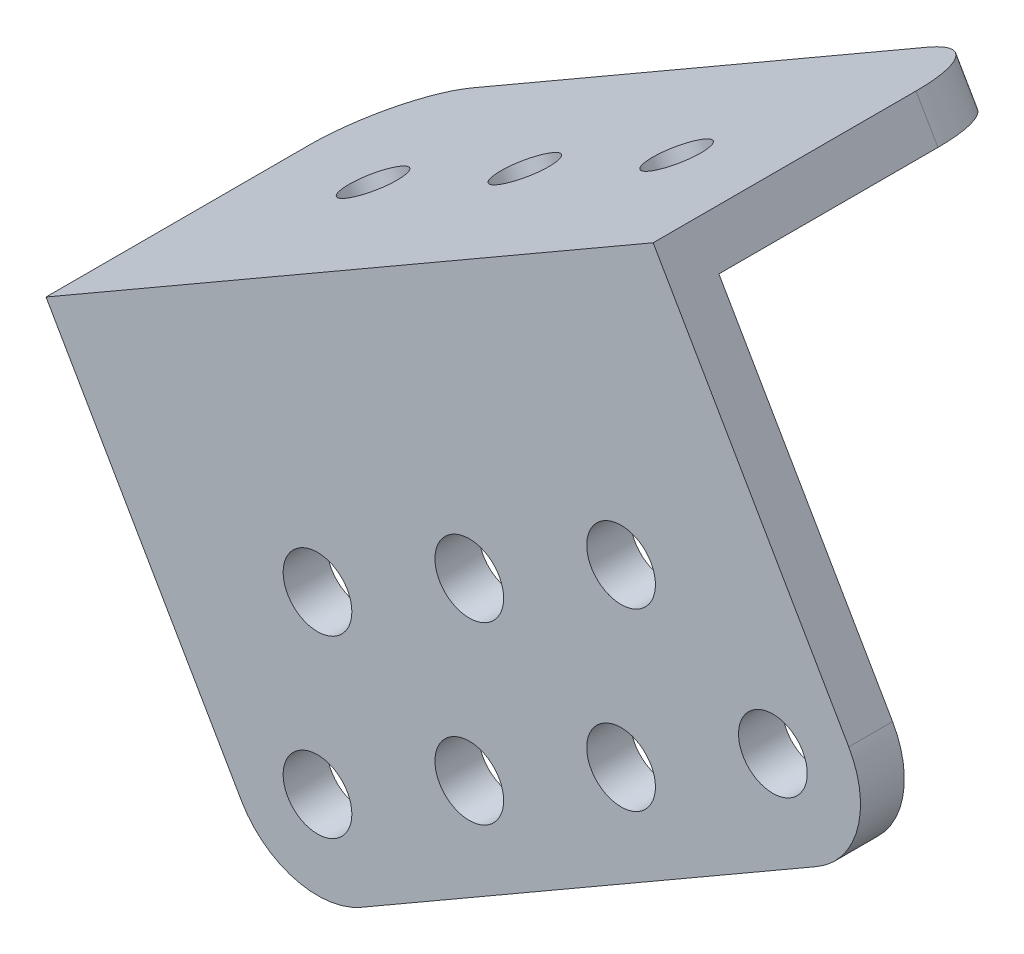
ISO-10303-21;
HEADER;
FILE_DESCRIPTION(('STEP AP214'),'2;1');
FILE_NAME('part.step','',(''),(''),'','','');
FILE_SCHEMA(('AUTOMOTIVE_DESIGN { 1 0 10303 214 1 1 1 1 }'));
ENDSEC;
DATA;
#1=APPLICATION_CONTEXT('core data for automotive mechanical design processes');
#2=APPLICATION_PROTOCOL_DEFINITION('international standard','automotive_design',2000,#1);
#3=PRODUCT_CONTEXT('',#1,'mechanical');
#4=PRODUCT('Part','Part','',(#3));
#5=PRODUCT_RELATED_PRODUCT_CATEGORY('part','',(#4));
#6=PRODUCT_DEFINITION_FORMATION('','',#4);
#7=PRODUCT_DEFINITION_CONTEXT('part definition',#1,'design');
#8=PRODUCT_DEFINITION('design','',#6,#7);
#9=PRODUCT_DEFINITION_SHAPE('','',#8);
#10=(LENGTH_UNIT() NAMED_UNIT(*) SI_UNIT(.MILLI.,.METRE.));
#11=(NAMED_UNIT(*) PLANE_ANGLE_UNIT() SI_UNIT($,.RADIAN.));
#12=(NAMED_UNIT(*) SI_UNIT($,.STERADIAN.) SOLID_ANGLE_UNIT());
#13=UNCERTAINTY_MEASURE_WITH_UNIT(LENGTH_MEASURE(1.E-05),#10,'distance_accuracy_value','');
#14=(GEOMETRIC_REPRESENTATION_CONTEXT(3) GLOBAL_UNCERTAINTY_ASSIGNED_CONTEXT((#13)) GLOBAL_UNIT_ASSIGNED_CONTEXT((#10,
#11,#12)) REPRESENTATION_CONTEXT('',''));
#15=CARTESIAN_POINT('',(0.,0.,0.));
#16=DIRECTION('',(0.,0.,1.));
#17=DIRECTION('',(1.,0.,0.));
#18=AXIS2_PLACEMENT_3D('',#15,#16,#17);
#19=CARTESIAN_POINT('',(0.,0.,25.4));
#20=DIRECTION('',(0.,0.,1.));
#21=DIRECTION('',(1.,0.,0.));
#22=AXIS2_PLACEMENT_3D('',#19,#20,#21);
#23=PLANE('',#22);
#24=CARTESIAN_POINT('',(116.913296347439,132.964619955457,25.4));
#25=DIRECTION('',(0.,0.,1.));
#26=DIRECTION('',(1.,0.,0.));
#27=AXIS2_PLACEMENT_3D('',#24,#25,#26);
#28=CIRCLE('',#27,2.48920000000001);
#29=CARTESIAN_POINT('',(119.402496347439,132.964619955457,25.4));
#30=VERTEX_POINT('',#29);
#31=EDGE_CURVE('E186',#30,#30,#28,.T.);
#32=ORIENTED_EDGE('',*,*,#31,.F.);
#33=EDGE_LOOP('',(#32));
#34=FACE_BOUND('',#33,.T.);
#35=CARTESIAN_POINT('',(138.910341603564,132.964619955457,25.4));
#36=DIRECTION('',(0.,0.,1.));
#37=DIRECTION('',(1.,0.,0.));
#38=AXIS2_PLACEMENT_3D('',#35,#36,#37);
#39=CIRCLE('',#38,2.48920000000001);
#40=CARTESIAN_POINT('',(141.399541603564,132.964619955457,25.4));
#41=VERTEX_POINT('',#40);
#42=EDGE_CURVE('E194',#41,#41,#39,.T.);
#43=ORIENTED_EDGE('',*,*,#42,.F.);
#44=EDGE_LOOP('',(#43));
#45=FACE_BOUND('',#44,.T.);
#46=CARTESIAN_POINT('',(116.913296347439,120.264619955457,25.4));
#47=DIRECTION('',(0.,0.,1.));
#48=DIRECTION('',(1.,0.,0.));
#49=AXIS2_PLACEMENT_3D('',#46,#47,#48);
#50=CIRCLE('',#49,2.4892);
#51=CARTESIAN_POINT('',(119.402496347439,120.264619955457,25.4));
#52=VERTEX_POINT('',#51);
#53=EDGE_CURVE('E202',#52,#52,#50,.T.);
#54=ORIENTED_EDGE('',*,*,#53,.F.);
#55=EDGE_LOOP('',(#54));
#56=FACE_BOUND('',#55,.T.);
#57=DIRECTION('',(0.866025403784439,0.5,0.));
#58=VECTOR('',#57,1.);
#59=CARTESIAN_POINT('',(103.590512405345,105.240358641426,25.4));
#60=LINE('',#59,#58);
#61=CARTESIAN_POINT('',(109.089773719377,108.415358641426,25.4));
#62=VERTEX_POINT('',#61);
#63=CARTESIAN_POINT('',(142.085341603564,127.465358641426,25.4));
#64=VERTEX_POINT('',#63);
#65=EDGE_CURVE('E211',#62,#64,#60,.T.);
#66=ORIENTED_EDGE('',*,*,#65,.T.);
#67=CARTESIAN_POINT('',(138.910341603564,132.964619955457,25.4));
#68=DIRECTION('',(0.,0.,1.));
#69=DIRECTION('',(1.,0.,0.));
#70=AXIS2_PLACEMENT_3D('',#67,#68,#69);
#71=CIRCLE('',#70,6.35);
#72=CARTESIAN_POINT('',(144.409602917595,136.139619955457,25.4));
#73=VERTEX_POINT('',#72);
#74=EDGE_CURVE('E271',#64,#73,#71,.T.);
#75=ORIENTED_EDGE('',*,*,#74,.T.);
#76=DIRECTION('',(-0.5,0.866025403784439,0.));
#77=VECTOR('',#76,1.);
#78=CARTESIAN_POINT('',(147.584602917595,130.640358641426,25.4));
#79=LINE('',#78,#77);
#80=CARTESIAN_POINT('',(130.236080289533,160.688881269488,25.4));
#81=VERTEX_POINT('',#80);
#82=EDGE_CURVE('E215',#73,#81,#79,.T.);
#83=ORIENTED_EDGE('',*,*,#82,.T.);
#84=DIRECTION('',(-0.866025403784439,-0.5,0.));
#85=VECTOR('',#84,1.);
#86=CARTESIAN_POINT('',(86.2419897772831,135.288881269488,25.4));
#87=LINE('',#86,#85);
#88=CARTESIAN_POINT('',(86.2419897772831,135.288881269488,25.4));
#89=VERTEX_POINT('',#88);
#90=EDGE_CURVE('E218',#81,#89,#87,.T.);
#91=ORIENTED_EDGE('',*,*,#90,.T.);
#92=DIRECTION('',(0.5,-0.866025403784438,0.));
#93=VECTOR('',#92,1.);
#94=CARTESIAN_POINT('',(86.2419897772831,135.288881269488,25.4));
#95=LINE('',#94,#93);
#96=CARTESIAN_POINT('',(100.415512405345,110.739619955457,25.4));
#97=VERTEX_POINT('',#96);
#98=EDGE_CURVE('E221',#89,#97,#95,.T.);
#99=ORIENTED_EDGE('',*,*,#98,.T.);
#100=CARTESIAN_POINT('',(105.914773719377,113.914619955457,25.4));
#101=DIRECTION('',(0.,0.,1.));
#102=DIRECTION('',(1.,0.,0.));
#103=AXIS2_PLACEMENT_3D('',#100,#101,#102);
#104=CIRCLE('',#103,6.35);
#105=EDGE_CURVE('E268',#97,#62,#104,.T.);
#106=ORIENTED_EDGE('',*,*,#105,.T.);
#107=EDGE_LOOP('',(#66,#75,#83,#91,#99,#106));
#108=FACE_BOUND('',#107,.T.);
#109=CARTESIAN_POINT('',(105.914773719377,113.914619955457,25.4));
#110=DIRECTION('',(0.,0.,1.));
#111=DIRECTION('',(1.,0.,0.));
#112=AXIS2_PLACEMENT_3D('',#109,#110,#111);
#113=CIRCLE('',#112,2.4892);
#114=CARTESIAN_POINT('',(108.403973719377,113.914619955457,25.4));
#115=VERTEX_POINT('',#114);
#116=EDGE_CURVE('E206',#115,#115,#113,.T.);
#117=ORIENTED_EDGE('',*,*,#116,.F.);
#118=EDGE_LOOP('',(#117));
#119=FACE_BOUND('',#118,.T.);
#120=CARTESIAN_POINT('',(127.911818975501,126.614619955457,25.4));
#121=DIRECTION('',(0.,0.,1.));
#122=DIRECTION('',(1.,0.,0.));
#123=AXIS2_PLACEMENT_3D('',#120,#121,#122);
#124=CIRCLE('',#123,2.48919999999997);
#125=CARTESIAN_POINT('',(130.401018975501,126.614619955457,25.4));
#126=VERTEX_POINT('',#125);
#127=EDGE_CURVE('E198',#126,#126,#124,.T.);
#128=ORIENTED_EDGE('',*,*,#127,.F.);
#129=EDGE_LOOP('',(#128));
#130=FACE_BOUND('',#129,.T.);
#131=CARTESIAN_POINT('',(127.911818975501,139.314619955457,25.4));
#132=DIRECTION('',(0.,0.,1.));
#133=DIRECTION('',(1.,0.,0.));
#134=AXIS2_PLACEMENT_3D('',#131,#132,#133);
#135=CIRCLE('',#134,2.48919999999997);
#136=CARTESIAN_POINT('',(130.401018975501,139.314619955457,25.4));
#137=VERTEX_POINT('',#136);
#138=EDGE_CURVE('E190',#137,#137,#135,.T.);
#139=ORIENTED_EDGE('',*,*,#138,.F.);
#140=EDGE_LOOP('',(#139));
#141=FACE_BOUND('',#140,.T.);
#142=CARTESIAN_POINT('',(105.914773719377,126.614619955457,25.4));
#143=DIRECTION('',(0.,0.,1.));
#144=DIRECTION('',(1.,0.,0.));
#145=AXIS2_PLACEMENT_3D('',#142,#143,#144);
#146=CIRCLE('',#145,2.48919999999998);
#147=CARTESIAN_POINT('',(108.403973719377,126.614619955457,25.4));
#148=VERTEX_POINT('',#147);
#149=EDGE_CURVE('E182',#148,#148,#146,.T.);
#150=ORIENTED_EDGE('',*,*,#149,.F.);
#151=EDGE_LOOP('',(#150));
#152=FACE_BOUND('',#151,.T.);
#153=ADVANCED_FACE('F37',(#34,#45,#56,#108,#119,#130,#141,#152),#23,.T.);
#154=CARTESIAN_POINT('',(0.,0.,0.));
#155=DIRECTION('',(0.,0.,1.));
#156=DIRECTION('',(1.,0.,0.));
#157=AXIS2_PLACEMENT_3D('',#154,#155,#156);
#158=PLANE('',#157);
#159=DIRECTION('',(-0.866025403784438,-0.500000000000001,0.));
#160=VECTOR('',#159,1.);
#161=CARTESIAN_POINT('',(144.834972260579,165.451381269489,0.));
#162=LINE('',#161,#160);
#163=CARTESIAN_POINT('',(126.324318975501,154.764250612473,0.));
#164=VERTEX_POINT('',#163);
#165=CARTESIAN_POINT('',(93.3287510913142,135.714250612473,0.));
#166=VERTEX_POINT('',#165);
#167=EDGE_CURVE('E135',#164,#166,#162,.T.);
#168=ORIENTED_EDGE('',*,*,#167,.T.);
#169=DIRECTION('',(0.5,-0.866025403784438,0.));
#170=VECTOR('',#169,1.);
#171=CARTESIAN_POINT('',(128.76255766147,74.3410973273947,0.));
#172=LINE('',#171,#170);
#173=CARTESIAN_POINT('',(91.7412510913142,138.463881269488,0.));
#174=VERTEX_POINT('',#173);
#175=EDGE_CURVE('E53',#166,#174,#172,.F.);
#176=ORIENTED_EDGE('',*,*,#175,.T.);
#177=DIRECTION('',(-0.866025403784439,-0.5,0.));
#178=VECTOR('',#177,1.);
#179=CARTESIAN_POINT('',(86.2419897772831,135.288881269488,0.));
#180=LINE('',#179,#178);
#181=CARTESIAN_POINT('',(124.736818975501,157.513881269488,0.));
#182=VERTEX_POINT('',#181);
#183=EDGE_CURVE('E210',#182,#174,#180,.T.);
#184=ORIENTED_EDGE('',*,*,#183,.F.);
#185=DIRECTION('',(-0.5,0.866025403784439,0.));
#186=VECTOR('',#185,1.);
#187=CARTESIAN_POINT('',(161.758125545657,93.3910973273946,0.));
#188=LINE('',#187,#186);
#189=EDGE_CURVE('E285',#182,#164,#188,.F.);
#190=ORIENTED_EDGE('',*,*,#189,.T.);
#191=EDGE_LOOP('',(#168,#176,#184,#190));
#192=FACE_BOUND('',#191,.T.);
#193=ADVANCED_FACE('F334',(#192),#158,.F.);
#194=CARTESIAN_POINT('',(103.590512405345,105.240358641426,25.4));
#195=DIRECTION('',(-0.5,0.866025403784439,0.));
#196=DIRECTION('',(-0.866025403784439,-0.5,0.));
#197=AXIS2_PLACEMENT_3D('',#194,#195,#196);
#198=PLANE('',#197);
#199=DIRECTION('',(-0.866025403784438,-0.500000000000001,0.));
#200=VECTOR('',#199,1.);
#201=CARTESIAN_POINT('',(160.595994888642,138.152489298442,22.225));
#202=LINE('',#201,#200);
#203=CARTESIAN_POINT('',(142.085341603564,127.465358641426,22.225));
#204=VERTEX_POINT('',#203);
#205=CARTESIAN_POINT('',(109.089773719377,108.415358641426,22.225));
#206=VERTEX_POINT('',#205);
#207=EDGE_CURVE('E136',#204,#206,#202,.T.);
#208=ORIENTED_EDGE('',*,*,#207,.F.);
#209=DIRECTION('',(0.,0.,-1.));
#210=VECTOR('',#209,1.);
#211=CARTESIAN_POINT('',(142.085341603564,127.465358641426,25.4));
#212=LINE('',#211,#210);
#213=EDGE_CURVE('E265',#204,#64,#212,.F.);
#214=ORIENTED_EDGE('',*,*,#213,.T.);
#215=ORIENTED_EDGE('',*,*,#65,.F.);
#216=DIRECTION('',(0.,0.,-1.));
#217=VECTOR('',#216,1.);
#218=CARTESIAN_POINT('',(109.089773719377,108.415358641426,25.4));
#219=LINE('',#218,#217);
#220=EDGE_CURVE('E261',#62,#206,#219,.T.);
#221=ORIENTED_EDGE('',*,*,#220,.T.);
#222=EDGE_LOOP('',(#208,#214,#215,#221));
#223=FACE_BOUND('',#222,.T.);
#224=ADVANCED_FACE('F356',(#223),#198,.F.);
#225=CARTESIAN_POINT('',(147.584602917595,130.640358641426,25.4));
#226=DIRECTION('',(-0.866025403784439,-0.5,0.));
#227=DIRECTION('',(0.5,-0.866025403784439,0.));
#228=AXIS2_PLACEMENT_3D('',#225,#226,#227);
#229=PLANE('',#228);
#230=ORIENTED_EDGE('',*,*,#82,.F.);
#231=DIRECTION('',(0.,0.,-1.));
#232=VECTOR('',#231,1.);
#233=CARTESIAN_POINT('',(144.409602917595,136.139619955457,25.4));
#234=LINE('',#233,#232);
#235=CARTESIAN_POINT('',(144.409602917595,136.139619955457,22.225));
#236=VERTEX_POINT('',#235);
#237=EDGE_CURVE('E252',#73,#236,#234,.T.);
#238=ORIENTED_EDGE('',*,*,#237,.T.);
#239=DIRECTION('',(-0.5,0.866025403784439,0.));
#240=VECTOR('',#239,1.);
#241=CARTESIAN_POINT('',(147.584602917595,130.640358641426,22.225));
#242=LINE('',#241,#240);
#243=CARTESIAN_POINT('',(131.823580289533,157.939250612473,22.225));
#244=VERTEX_POINT('',#243);
#245=EDGE_CURVE('E177',#236,#244,#242,.T.);
#246=ORIENTED_EDGE('',*,*,#245,.T.);
#247=DIRECTION('',(0.,0.,-1.));
#248=VECTOR('',#247,1.);
#249=CARTESIAN_POINT('',(131.823580289533,157.939250612473,25.4));
#250=LINE('',#249,#248);
#251=CARTESIAN_POINT('',(131.823580289533,157.939250612473,6.35));
#252=VERTEX_POINT('',#251);
#253=EDGE_CURVE('E133',#244,#252,#250,.T.);
#254=ORIENTED_EDGE('',*,*,#253,.T.);
#255=DIRECTION('',(-0.5,0.866025403784439,0.));
#256=VECTOR('',#255,1.);
#257=CARTESIAN_POINT('',(147.584602917595,130.640358641426,6.35));
#258=LINE('',#257,#256);
#259=CARTESIAN_POINT('',(130.236080289533,160.688881269488,6.35));
#260=VERTEX_POINT('',#259);
#261=EDGE_CURVE('E233',#252,#260,#258,.T.);
#262=ORIENTED_EDGE('',*,*,#261,.T.);
#263=DIRECTION('',(0.,0.,-1.));
#264=VECTOR('',#263,1.);
#265=CARTESIAN_POINT('',(130.236080289533,160.688881269488,25.4));
#266=LINE('',#265,#264);
#267=EDGE_CURVE('E230',#81,#260,#266,.T.);
#268=ORIENTED_EDGE('',*,*,#267,.F.);
#269=EDGE_LOOP('',(#230,#238,#246,#254,#262,#268));
#270=FACE_BOUND('',#269,.T.);
#271=ADVANCED_FACE('F341',(#270),#229,.F.);
#272=CARTESIAN_POINT('',(86.2419897772831,135.288881269488,25.4));
#273=DIRECTION('',(0.5,-0.866025403784439,0.));
#274=DIRECTION('',(0.866025403784439,0.5,0.));
#275=AXIS2_PLACEMENT_3D('',#272,#273,#274);
#276=PLANE('',#275);
#277=CARTESIAN_POINT('',(108.239035033408,147.988881269489,12.7));
#278=DIRECTION('',(-0.5,0.866025403784439,0.));
#279=DIRECTION('',(-0.866025403784439,-0.5,0.));
#280=AXIS2_PLACEMENT_3D('',#277,#278,#279);
#281=CIRCLE('',#280,2.01930000000001);
#282=CARTESIAN_POINT('',(106.490269935546,146.979231269489,12.7));
#283=VERTEX_POINT('',#282);
#284=EDGE_CURVE('E651',#283,#283,#281,.T.);
#285=ORIENTED_EDGE('',*,*,#284,.F.);
#286=EDGE_LOOP('',(#285));
#287=FACE_BOUND('',#286,.T.);
#288=CARTESIAN_POINT('',(119.23755766147,154.338881269489,12.7));
#289=DIRECTION('',(-0.5,0.866025403784439,0.));
#290=DIRECTION('',(-0.866025403784439,-0.5,0.));
#291=AXIS2_PLACEMENT_3D('',#288,#289,#290);
#292=CIRCLE('',#291,2.01929999999999);
#293=CARTESIAN_POINT('',(117.488792563608,153.329231269489,12.7));
#294=VERTEX_POINT('',#293);
#295=EDGE_CURVE('E654',#294,#294,#292,.T.);
#296=ORIENTED_EDGE('',*,*,#295,.F.);
#297=EDGE_LOOP('',(#296));
#298=FACE_BOUND('',#297,.T.);
#299=CARTESIAN_POINT('',(97.2405124053454,141.638881269489,12.7));
#300=DIRECTION('',(-0.5,0.866025403784439,0.));
#301=DIRECTION('',(-0.866025403784439,-0.5,0.));
#302=AXIS2_PLACEMENT_3D('',#299,#300,#301);
#303=CIRCLE('',#302,2.01930000000002);
#304=CARTESIAN_POINT('',(95.4917473074835,140.629231269489,12.7));
#305=VERTEX_POINT('',#304);
#306=EDGE_CURVE('E242',#305,#305,#303,.T.);
#307=ORIENTED_EDGE('',*,*,#306,.F.);
#308=EDGE_LOOP('',(#307));
#309=FACE_BOUND('',#308,.T.);
#310=ORIENTED_EDGE('',*,*,#183,.T.);
#311=CARTESIAN_POINT('',(91.7412510913142,138.463881269488,6.35));
#312=DIRECTION('',(0.5,-0.866025403784439,0.));
#313=DIRECTION('',(0.866025403784439,0.5,0.));
#314=AXIS2_PLACEMENT_3D('',#311,#312,#313);
#315=CIRCLE('',#314,6.35);
#316=CARTESIAN_POINT('',(86.2419897772831,135.288881269488,6.35));
#317=VERTEX_POINT('',#316);
#318=EDGE_CURVE('E11',#174,#317,#315,.F.);
#319=ORIENTED_EDGE('',*,*,#318,.T.);
#320=DIRECTION('',(0.,0.,-1.));
#321=VECTOR('',#320,1.);
#322=CARTESIAN_POINT('',(86.2419897772831,135.288881269488,25.4));
#323=LINE('',#322,#321);
#324=EDGE_CURVE('E225',#89,#317,#323,.T.);
#325=ORIENTED_EDGE('',*,*,#324,.F.);
#326=ORIENTED_EDGE('',*,*,#90,.F.);
#327=ORIENTED_EDGE('',*,*,#267,.T.);
#328=CARTESIAN_POINT('',(124.736818975501,157.513881269488,6.35));
#329=DIRECTION('',(0.5,-0.866025403784439,0.));
#330=DIRECTION('',(0.866025403784439,0.5,0.));
#331=AXIS2_PLACEMENT_3D('',#328,#329,#330);
#332=CIRCLE('',#331,6.35);
#333=EDGE_CURVE('E46',#260,#182,#332,.F.);
#334=ORIENTED_EDGE('',*,*,#333,.T.);
#335=EDGE_LOOP('',(#310,#319,#325,#326,#327,#334));
#336=FACE_BOUND('',#335,.T.);
#337=ADVANCED_FACE('F343',(#287,#298,#309,#336),#276,.F.);
#338=CARTESIAN_POINT('',(86.2419897772831,135.288881269488,25.4));
#339=DIRECTION('',(0.866025403784438,0.5,0.));
#340=DIRECTION('',(-0.5,0.866025403784438,0.));
#341=AXIS2_PLACEMENT_3D('',#338,#339,#340);
#342=PLANE('',#341);
#343=DIRECTION('',(-0.500000000000001,0.866025403784438,0.));
#344=VECTOR('',#343,1.);
#345=CARTESIAN_POINT('',(103.590512405345,105.240358641426,22.225));
#346=LINE('',#345,#344);
#347=CARTESIAN_POINT('',(100.415512405345,110.739619955457,22.225));
#348=VERTEX_POINT('',#347);
#349=CARTESIAN_POINT('',(87.8294897772831,132.539250612473,22.225));
#350=VERTEX_POINT('',#349);
#351=EDGE_CURVE('E114',#348,#350,#346,.T.);
#352=ORIENTED_EDGE('',*,*,#351,.F.);
#353=DIRECTION('',(0.,0.,-1.));
#354=VECTOR('',#353,1.);
#355=CARTESIAN_POINT('',(100.415512405345,110.739619955457,25.4));
#356=LINE('',#355,#354);
#357=EDGE_CURVE('E276',#348,#97,#356,.F.);
#358=ORIENTED_EDGE('',*,*,#357,.T.);
#359=ORIENTED_EDGE('',*,*,#98,.F.);
#360=ORIENTED_EDGE('',*,*,#324,.T.);
#361=DIRECTION('',(0.5,-0.866025403784438,0.));
#362=VECTOR('',#361,1.);
#363=CARTESIAN_POINT('',(86.2419897772831,135.288881269488,6.35));
#364=LINE('',#363,#362);
#365=CARTESIAN_POINT('',(87.8294897772831,132.539250612473,6.35));
#366=VERTEX_POINT('',#365);
#367=EDGE_CURVE('E142',#317,#366,#364,.T.);
#368=ORIENTED_EDGE('',*,*,#367,.T.);
#369=DIRECTION('',(0.,0.,-1.));
#370=VECTOR('',#369,1.);
#371=CARTESIAN_POINT('',(87.8294897772831,132.539250612473,0.));
#372=LINE('',#371,#370);
#373=EDGE_CURVE('E125',#350,#366,#372,.T.);
#374=ORIENTED_EDGE('',*,*,#373,.F.);
#375=EDGE_LOOP('',(#352,#358,#359,#360,#368,#374));
#376=FACE_BOUND('',#375,.T.);
#377=ADVANCED_FACE('F139',(#376),#342,.F.);
#378=CARTESIAN_POINT('',(105.914773719377,113.914619955457,25.4));
#379=DIRECTION('',(0.,0.,-1.));
#380=DIRECTION('',(-1.,0.,0.));
#381=AXIS2_PLACEMENT_3D('',#378,#379,#380);
#382=CYLINDRICAL_SURFACE('',#381,2.4892);
#383=CARTESIAN_POINT('',(105.914773719377,113.914619955457,22.225));
#384=DIRECTION('',(0.,0.,1.));
#385=DIRECTION('',(0.,-1.,0.));
#386=AXIS2_PLACEMENT_3D('',#383,#384,#385);
#387=CIRCLE('',#386,2.4892);
#388=CARTESIAN_POINT('',(105.914773719377,111.425419955457,22.225));
#389=VERTEX_POINT('',#388);
#390=EDGE_CURVE('E173',#389,#389,#387,.T.);
#391=ORIENTED_EDGE('',*,*,#390,.F.);
#392=EDGE_LOOP('',(#391));
#393=FACE_BOUND('',#392,.T.);
#394=ORIENTED_EDGE('',*,*,#116,.T.);
#395=EDGE_LOOP('',(#394));
#396=FACE_BOUND('',#395,.T.);
#397=ADVANCED_FACE('F380',(#393,#396),#382,.F.);
#398=CARTESIAN_POINT('',(116.913296347439,120.264619955457,25.4));
#399=DIRECTION('',(0.,0.,-1.));
#400=DIRECTION('',(-1.,0.,0.));
#401=AXIS2_PLACEMENT_3D('',#398,#399,#400);
#402=CYLINDRICAL_SURFACE('',#401,2.4892);
#403=CARTESIAN_POINT('',(116.913296347439,120.264619955457,22.225));
#404=DIRECTION('',(0.,0.,1.));
#405=DIRECTION('',(0.,-1.,0.));
#406=AXIS2_PLACEMENT_3D('',#403,#404,#405);
#407=CIRCLE('',#406,2.4892);
#408=CARTESIAN_POINT('',(116.913296347439,117.775419955457,22.225));
#409=VERTEX_POINT('',#408);
#410=EDGE_CURVE('E169',#409,#409,#407,.T.);
#411=ORIENTED_EDGE('',*,*,#410,.F.);
#412=EDGE_LOOP('',(#411));
#413=FACE_BOUND('',#412,.T.);
#414=ORIENTED_EDGE('',*,*,#53,.T.);
#415=EDGE_LOOP('',(#414));
#416=FACE_BOUND('',#415,.T.);
#417=ADVANCED_FACE('F436',(#413,#416),#402,.F.);
#418=CARTESIAN_POINT('',(127.911818975501,126.614619955457,25.4));
#419=DIRECTION('',(0.,0.,-1.));
#420=DIRECTION('',(-1.,0.,0.));
#421=AXIS2_PLACEMENT_3D('',#418,#419,#420);
#422=CYLINDRICAL_SURFACE('',#421,2.48919999999997);
#423=CARTESIAN_POINT('',(127.911818975501,126.614619955457,22.225));
#424=DIRECTION('',(0.,0.,1.));
#425=DIRECTION('',(0.,-1.,0.));
#426=AXIS2_PLACEMENT_3D('',#423,#424,#425);
#427=CIRCLE('',#426,2.48919999999997);
#428=CARTESIAN_POINT('',(127.911818975501,124.125419955457,22.225));
#429=VERTEX_POINT('',#428);
#430=EDGE_CURVE('E165',#429,#429,#427,.T.);
#431=ORIENTED_EDGE('',*,*,#430,.F.);
#432=EDGE_LOOP('',(#431));
#433=FACE_BOUND('',#432,.T.);
#434=ORIENTED_EDGE('',*,*,#127,.T.);
#435=EDGE_LOOP('',(#434));
#436=FACE_BOUND('',#435,.T.);
#437=ADVANCED_FACE('F433',(#433,#436),#422,.F.);
#438=CARTESIAN_POINT('',(138.910341603564,132.964619955457,25.4));
#439=DIRECTION('',(0.,0.,-1.));
#440=DIRECTION('',(-1.,0.,0.));
#441=AXIS2_PLACEMENT_3D('',#438,#439,#440);
#442=CYLINDRICAL_SURFACE('',#441,2.48920000000001);
#443=CARTESIAN_POINT('',(138.910341603564,132.964619955457,22.225));
#444=DIRECTION('',(0.,0.,1.));
#445=DIRECTION('',(0.,-1.,0.));
#446=AXIS2_PLACEMENT_3D('',#443,#444,#445);
#447=CIRCLE('',#446,2.48920000000001);
#448=CARTESIAN_POINT('',(138.910341603564,130.475419955457,22.225));
#449=VERTEX_POINT('',#448);
#450=EDGE_CURVE('E161',#449,#449,#447,.T.);
#451=ORIENTED_EDGE('',*,*,#450,.F.);
#452=EDGE_LOOP('',(#451));
#453=FACE_BOUND('',#452,.T.);
#454=ORIENTED_EDGE('',*,*,#42,.T.);
#455=EDGE_LOOP('',(#454));
#456=FACE_BOUND('',#455,.T.);
#457=ADVANCED_FACE('F429',(#453,#456),#442,.F.);
#458=CARTESIAN_POINT('',(127.911818975501,139.314619955457,25.4));
#459=DIRECTION('',(0.,0.,-1.));
#460=DIRECTION('',(-1.,0.,0.));
#461=AXIS2_PLACEMENT_3D('',#458,#459,#460);
#462=CYLINDRICAL_SURFACE('',#461,2.48919999999997);
#463=CARTESIAN_POINT('',(127.911818975501,139.314619955457,22.225));
#464=DIRECTION('',(0.,0.,1.));
#465=DIRECTION('',(0.,-1.,0.));
#466=AXIS2_PLACEMENT_3D('',#463,#464,#465);
#467=CIRCLE('',#466,2.48919999999997);
#468=CARTESIAN_POINT('',(127.911818975501,136.825419955457,22.225));
#469=VERTEX_POINT('',#468);
#470=EDGE_CURVE('E157',#469,#469,#467,.T.);
#471=ORIENTED_EDGE('',*,*,#470,.F.);
#472=EDGE_LOOP('',(#471));
#473=FACE_BOUND('',#472,.T.);
#474=ORIENTED_EDGE('',*,*,#138,.T.);
#475=EDGE_LOOP('',(#474));
#476=FACE_BOUND('',#475,.T.);
#477=ADVANCED_FACE('F425',(#473,#476),#462,.F.);
#478=CARTESIAN_POINT('',(116.913296347439,132.964619955457,25.4));
#479=DIRECTION('',(0.,0.,-1.));
#480=DIRECTION('',(-1.,0.,0.));
#481=AXIS2_PLACEMENT_3D('',#478,#479,#480);
#482=CYLINDRICAL_SURFACE('',#481,2.48920000000001);
#483=CARTESIAN_POINT('',(116.913296347439,132.964619955457,22.225));
#484=DIRECTION('',(0.,0.,1.));
#485=DIRECTION('',(0.,-1.,0.));
#486=AXIS2_PLACEMENT_3D('',#483,#484,#485);
#487=CIRCLE('',#486,2.48920000000001);
#488=CARTESIAN_POINT('',(116.913296347439,130.475419955457,22.225));
#489=VERTEX_POINT('',#488);
#490=EDGE_CURVE('E153',#489,#489,#487,.T.);
#491=ORIENTED_EDGE('',*,*,#490,.F.);
#492=EDGE_LOOP('',(#491));
#493=FACE_BOUND('',#492,.T.);
#494=ORIENTED_EDGE('',*,*,#31,.T.);
#495=EDGE_LOOP('',(#494));
#496=FACE_BOUND('',#495,.T.);
#497=ADVANCED_FACE('F421',(#493,#496),#482,.F.);
#498=CARTESIAN_POINT('',(105.914773719377,126.614619955457,25.4));
#499=DIRECTION('',(0.,0.,-1.));
#500=DIRECTION('',(-1.,0.,0.));
#501=AXIS2_PLACEMENT_3D('',#498,#499,#500);
#502=CYLINDRICAL_SURFACE('',#501,2.48919999999998);
#503=CARTESIAN_POINT('',(105.914773719377,126.614619955457,22.225));
#504=DIRECTION('',(0.,0.,1.));
#505=DIRECTION('',(0.,-1.,0.));
#506=AXIS2_PLACEMENT_3D('',#503,#504,#505);
#507=CIRCLE('',#506,2.48919999999998);
#508=CARTESIAN_POINT('',(105.914773719377,124.125419955457,22.225));
#509=VERTEX_POINT('',#508);
#510=EDGE_CURVE('E151',#509,#509,#507,.T.);
#511=ORIENTED_EDGE('',*,*,#510,.F.);
#512=EDGE_LOOP('',(#511));
#513=FACE_BOUND('',#512,.T.);
#514=ORIENTED_EDGE('',*,*,#149,.T.);
#515=EDGE_LOOP('',(#514));
#516=FACE_BOUND('',#515,.T.);
#517=ADVANCED_FACE('F414',(#513,#516),#502,.F.);
#518=CARTESIAN_POINT('',(144.834972260579,165.451381269489,0.));
#519=DIRECTION('',(-0.500000000000001,0.866025403784438,0.));
#520=DIRECTION('',(-0.866025403784438,-0.500000000000001,0.));
#521=AXIS2_PLACEMENT_3D('',#518,#519,#520);
#522=PLANE('',#521);
#523=CARTESIAN_POINT('',(109.826535033408,145.239250612473,12.7));
#524=DIRECTION('',(-0.500000000000001,0.866025403784438,0.));
#525=DIRECTION('',(-0.866025403784438,-0.500000000000001,0.));
#526=AXIS2_PLACEMENT_3D('',#523,#524,#525);
#527=CIRCLE('',#526,2.01930000000001);
#528=CARTESIAN_POINT('',(108.077769935546,144.229600612473,12.7));
#529=VERTEX_POINT('',#528);
#530=EDGE_CURVE('E126',#529,#529,#527,.T.);
#531=ORIENTED_EDGE('',*,*,#530,.T.);
#532=EDGE_LOOP('',(#531));
#533=FACE_BOUND('',#532,.T.);
#534=CARTESIAN_POINT('',(120.82505766147,151.589250612473,12.7));
#535=DIRECTION('',(-0.500000000000001,0.866025403784438,0.));
#536=DIRECTION('',(-0.866025403784438,-0.500000000000001,0.));
#537=AXIS2_PLACEMENT_3D('',#534,#535,#536);
#538=CIRCLE('',#537,2.01929999999999);
#539=CARTESIAN_POINT('',(119.076292563608,150.579600612473,12.7));
#540=VERTEX_POINT('',#539);
#541=EDGE_CURVE('E241',#540,#540,#538,.T.);
#542=ORIENTED_EDGE('',*,*,#541,.T.);
#543=EDGE_LOOP('',(#542));
#544=FACE_BOUND('',#543,.T.);
#545=CARTESIAN_POINT('',(98.8280124053455,138.889250612473,12.7));
#546=DIRECTION('',(-0.500000000000001,0.866025403784438,0.));
#547=DIRECTION('',(-0.866025403784438,-0.500000000000001,0.));
#548=AXIS2_PLACEMENT_3D('',#545,#546,#547);
#549=CIRCLE('',#548,2.01930000000002);
#550=CARTESIAN_POINT('',(97.0792473074835,137.879600612473,12.7));
#551=VERTEX_POINT('',#550);
#552=EDGE_CURVE('E237',#551,#551,#549,.T.);
#553=ORIENTED_EDGE('',*,*,#552,.T.);
#554=EDGE_LOOP('',(#553));
#555=FACE_BOUND('',#554,.T.);
#556=ORIENTED_EDGE('',*,*,#373,.T.);
#557=CARTESIAN_POINT('',(93.3287510913142,135.714250612473,6.35));
#558=DIRECTION('',(-0.500000000000001,0.866025403784438,0.));
#559=DIRECTION('',(-0.866025403784438,-0.500000000000001,0.));
#560=AXIS2_PLACEMENT_3D('',#557,#558,#559);
#561=CIRCLE('',#560,6.35);
#562=EDGE_CURVE('E282',#366,#166,#561,.F.);
#563=ORIENTED_EDGE('',*,*,#562,.T.);
#564=ORIENTED_EDGE('',*,*,#167,.F.);
#565=CARTESIAN_POINT('',(126.324318975501,154.764250612473,6.35));
#566=DIRECTION('',(-0.500000000000001,0.866025403784438,0.));
#567=DIRECTION('',(-0.866025403784438,-0.500000000000001,0.));
#568=AXIS2_PLACEMENT_3D('',#565,#566,#567);
#569=CIRCLE('',#568,6.35);
#570=EDGE_CURVE('E279',#164,#252,#569,.F.);
#571=ORIENTED_EDGE('',*,*,#570,.T.);
#572=ORIENTED_EDGE('',*,*,#253,.F.);
#573=DIRECTION('',(-0.866025403784438,-0.500000000000001,0.));
#574=VECTOR('',#573,1.);
#575=CARTESIAN_POINT('',(144.834972260579,165.451381269489,22.225));
#576=LINE('',#575,#574);
#577=EDGE_CURVE('E118',#244,#350,#576,.T.);
#578=ORIENTED_EDGE('',*,*,#577,.T.);
#579=EDGE_LOOP('',(#556,#563,#564,#571,#572,#578));
#580=FACE_BOUND('',#579,.T.);
#581=ADVANCED_FACE('F131',(#533,#544,#555,#580),#522,.F.);
#582=CARTESIAN_POINT('',(160.595994888642,138.152489298442,22.225));
#583=DIRECTION('',(0.,0.,1.));
#584=DIRECTION('',(0.,-1.,0.));
#585=AXIS2_PLACEMENT_3D('',#582,#583,#584);
#586=PLANE('',#585);
#587=ORIENTED_EDGE('',*,*,#390,.T.);
#588=EDGE_LOOP('',(#587));
#589=FACE_BOUND('',#588,.T.);
#590=ORIENTED_EDGE('',*,*,#410,.T.);
#591=EDGE_LOOP('',(#590));
#592=FACE_BOUND('',#591,.T.);
#593=ORIENTED_EDGE('',*,*,#430,.T.);
#594=EDGE_LOOP('',(#593));
#595=FACE_BOUND('',#594,.T.);
#596=ORIENTED_EDGE('',*,*,#450,.T.);
#597=EDGE_LOOP('',(#596));
#598=FACE_BOUND('',#597,.T.);
#599=ORIENTED_EDGE('',*,*,#470,.T.);
#600=EDGE_LOOP('',(#599));
#601=FACE_BOUND('',#600,.T.);
#602=ORIENTED_EDGE('',*,*,#490,.T.);
#603=EDGE_LOOP('',(#602));
#604=FACE_BOUND('',#603,.T.);
#605=ORIENTED_EDGE('',*,*,#510,.T.);
#606=EDGE_LOOP('',(#605));
#607=FACE_BOUND('',#606,.T.);
#608=ORIENTED_EDGE('',*,*,#245,.F.);
#609=CARTESIAN_POINT('',(138.910341603564,132.964619955457,22.225));
#610=DIRECTION('',(0.,0.,1.));
#611=DIRECTION('',(0.,-1.,0.));
#612=AXIS2_PLACEMENT_3D('',#609,#610,#611);
#613=CIRCLE('',#612,6.35);
#614=EDGE_CURVE('E258',#236,#204,#613,.F.);
#615=ORIENTED_EDGE('',*,*,#614,.T.);
#616=ORIENTED_EDGE('',*,*,#207,.T.);
#617=CARTESIAN_POINT('',(105.914773719377,113.914619955457,22.225));
#618=DIRECTION('',(0.,0.,1.));
#619=DIRECTION('',(0.,-1.,0.));
#620=AXIS2_PLACEMENT_3D('',#617,#618,#619);
#621=CIRCLE('',#620,6.35);
#622=EDGE_CURVE('E120',#206,#348,#621,.F.);
#623=ORIENTED_EDGE('',*,*,#622,.T.);
#624=ORIENTED_EDGE('',*,*,#351,.T.);
#625=ORIENTED_EDGE('',*,*,#577,.F.);
#626=EDGE_LOOP('',(#608,#615,#616,#623,#624,#625));
#627=FACE_BOUND('',#626,.T.);
#628=ADVANCED_FACE('F117',(#589,#592,#595,#598,#601,#604,#607,#627),#586,.F.);
#629=CARTESIAN_POINT('',(125.58755766147,92.5403586414263,12.7));
#630=DIRECTION('',(-0.5,0.866025403784439,0.));
#631=DIRECTION('',(-0.866025403784439,-0.5,0.));
#632=AXIS2_PLACEMENT_3D('',#629,#630,#631);
#633=CYLINDRICAL_SURFACE('',#632,2.01930000000002);
#634=ORIENTED_EDGE('',*,*,#306,.T.);
#635=EDGE_LOOP('',(#634));
#636=FACE_BOUND('',#635,.T.);
#637=ORIENTED_EDGE('',*,*,#552,.F.);
#638=EDGE_LOOP('',(#637));
#639=FACE_BOUND('',#638,.T.);
#640=ADVANCED_FACE('F403',(#636,#639),#633,.F.);
#641=CARTESIAN_POINT('',(147.584602917595,105.240358641426,12.7));
#642=DIRECTION('',(-0.5,0.866025403784439,0.));
#643=DIRECTION('',(-0.866025403784439,-0.5,0.));
#644=AXIS2_PLACEMENT_3D('',#641,#642,#643);
#645=CYLINDRICAL_SURFACE('',#644,2.01929999999999);
#646=ORIENTED_EDGE('',*,*,#295,.T.);
#647=EDGE_LOOP('',(#646));
#648=FACE_BOUND('',#647,.T.);
#649=ORIENTED_EDGE('',*,*,#541,.F.);
#650=EDGE_LOOP('',(#649));
#651=FACE_BOUND('',#650,.T.);
#652=ADVANCED_FACE('F397',(#648,#651),#645,.F.);
#653=CARTESIAN_POINT('',(136.586080289533,98.8903586414262,12.7));
#654=DIRECTION('',(-0.5,0.866025403784439,0.));
#655=DIRECTION('',(-0.866025403784439,-0.5,0.));
#656=AXIS2_PLACEMENT_3D('',#653,#654,#655);
#657=CYLINDRICAL_SURFACE('',#656,2.01930000000001);
#658=ORIENTED_EDGE('',*,*,#284,.T.);
#659=EDGE_LOOP('',(#658));
#660=FACE_BOUND('',#659,.T.);
#661=ORIENTED_EDGE('',*,*,#530,.F.);
#662=EDGE_LOOP('',(#661));
#663=FACE_BOUND('',#662,.T.);
#664=ADVANCED_FACE('F393',(#660,#663),#657,.F.);
#665=CARTESIAN_POINT('',(138.910341603564,132.964619955457,25.4));
#666=DIRECTION('',(0.,0.,-1.));
#667=DIRECTION('',(-1.,0.,0.));
#668=AXIS2_PLACEMENT_3D('',#665,#666,#667);
#669=CYLINDRICAL_SURFACE('',#668,6.35);
#670=ORIENTED_EDGE('',*,*,#74,.F.);
#671=ORIENTED_EDGE('',*,*,#213,.F.);
#672=ORIENTED_EDGE('',*,*,#614,.F.);
#673=ORIENTED_EDGE('',*,*,#237,.F.);
#674=EDGE_LOOP('',(#670,#671,#672,#673));
#675=FACE_BOUND('',#674,.T.);
#676=ADVANCED_FACE('F352',(#675),#669,.T.);
#677=CARTESIAN_POINT('',(105.914773719377,113.914619955457,25.4));
#678=DIRECTION('',(0.,0.,-1.));
#679=DIRECTION('',(-1.,0.,0.));
#680=AXIS2_PLACEMENT_3D('',#677,#678,#679);
#681=CYLINDRICAL_SURFACE('',#680,6.35);
#682=ORIENTED_EDGE('',*,*,#105,.F.);
#683=ORIENTED_EDGE('',*,*,#357,.F.);
#684=ORIENTED_EDGE('',*,*,#622,.F.);
#685=ORIENTED_EDGE('',*,*,#220,.F.);
#686=EDGE_LOOP('',(#682,#683,#684,#685));
#687=FACE_BOUND('',#686,.T.);
#688=ADVANCED_FACE('F360',(#687),#681,.T.);
#689=CARTESIAN_POINT('',(91.7412510913142,138.463881269488,6.35));
#690=DIRECTION('',(0.5,-0.866025403784438,0.));
#691=DIRECTION('',(0.866025403784438,0.5,0.));
#692=AXIS2_PLACEMENT_3D('',#689,#690,#691);
#693=CYLINDRICAL_SURFACE('',#692,6.35);
#694=ORIENTED_EDGE('',*,*,#318,.F.);
#695=ORIENTED_EDGE('',*,*,#175,.F.);
#696=ORIENTED_EDGE('',*,*,#562,.F.);
#697=ORIENTED_EDGE('',*,*,#367,.F.);
#698=EDGE_LOOP('',(#694,#695,#696,#697));
#699=FACE_BOUND('',#698,.T.);
#700=ADVANCED_FACE('F363',(#699),#693,.T.);
#701=CARTESIAN_POINT('',(142.085341603564,127.465358641426,6.35));
#702=DIRECTION('',(-0.5,0.866025403784439,0.));
#703=DIRECTION('',(-0.866025403784439,-0.5,0.));
#704=AXIS2_PLACEMENT_3D('',#701,#702,#703);
#705=CYLINDRICAL_SURFACE('',#704,6.35);
#706=ORIENTED_EDGE('',*,*,#570,.F.);
#707=ORIENTED_EDGE('',*,*,#189,.F.);
#708=ORIENTED_EDGE('',*,*,#333,.F.);
#709=ORIENTED_EDGE('',*,*,#261,.F.);
#710=EDGE_LOOP('',(#706,#707,#708,#709));
#711=FACE_BOUND('',#710,.T.);
#712=ADVANCED_FACE('F39',(#711),#705,.T.);
#713=CLOSED_SHELL('',(#153,#193,#224,#271,#337,#377,#397,#417,#437,#457,#477,#497,#517,#581,
#628,#640,#652,#664,#676,#688,#700,#712));
#714=MANIFOLD_SOLID_BREP('B2',#713);
#715=ADVANCED_BREP_SHAPE_REPRESENTATION('',(#18,#714),#14);
#716=SHAPE_DEFINITION_REPRESENTATION(#9,#715);
ENDSEC;
END-ISO-10303-21;
